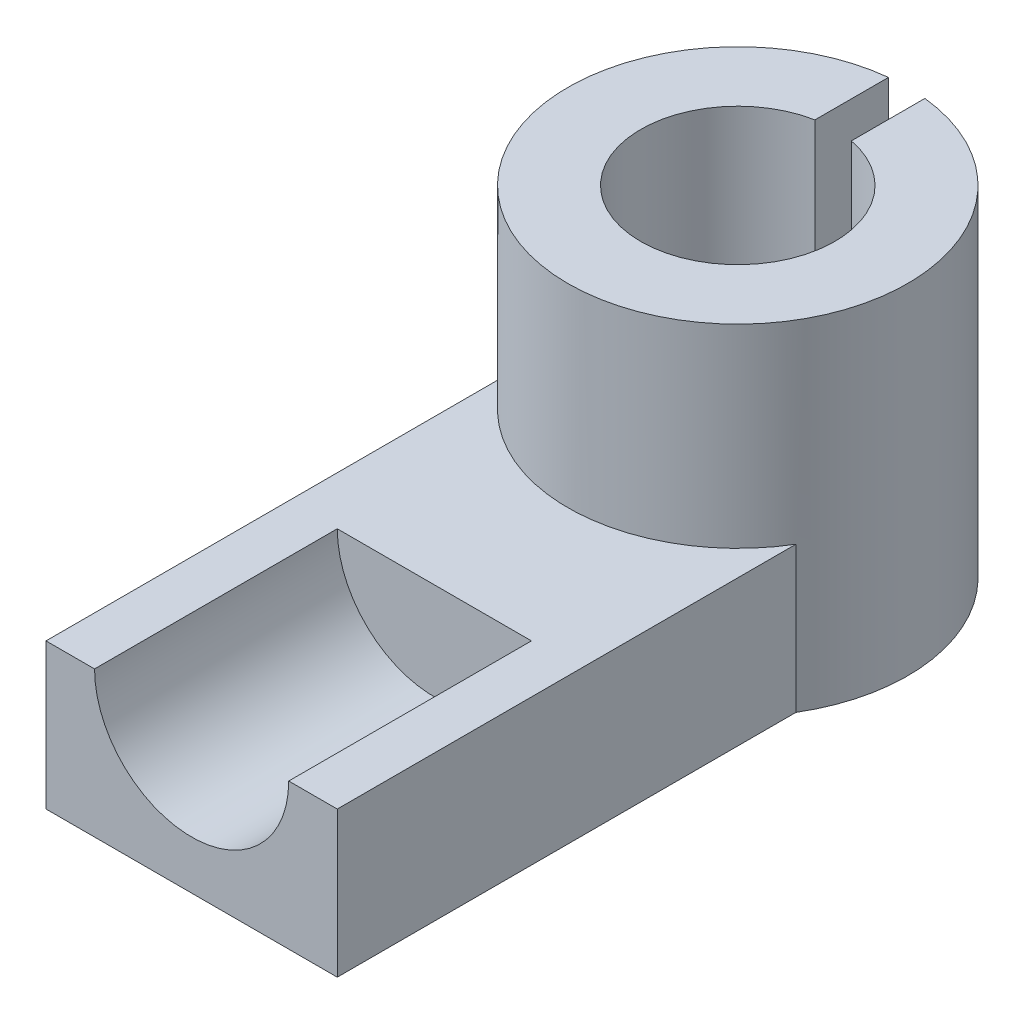
ISO-10303-21;
HEADER;
FILE_DESCRIPTION(('STEP AP214'),'2;1');
FILE_NAME('part.step','',(''),(''),'','','');
FILE_SCHEMA(('AUTOMOTIVE_DESIGN { 1 0 10303 214 1 1 1 1 }'));
ENDSEC;
DATA;
#1=APPLICATION_CONTEXT('core data for automotive mechanical design processes');
#2=APPLICATION_PROTOCOL_DEFINITION('international standard','automotive_design',2000,#1);
#3=PRODUCT_CONTEXT('',#1,'mechanical');
#4=PRODUCT('Part','Part','',(#3));
#5=PRODUCT_RELATED_PRODUCT_CATEGORY('part','',(#4));
#6=PRODUCT_DEFINITION_FORMATION('','',#4);
#7=PRODUCT_DEFINITION_CONTEXT('part definition',#1,'design');
#8=PRODUCT_DEFINITION('design','',#6,#7);
#9=PRODUCT_DEFINITION_SHAPE('','',#8);
#10=(LENGTH_UNIT() NAMED_UNIT(*) SI_UNIT(.MILLI.,.METRE.));
#11=(NAMED_UNIT(*) PLANE_ANGLE_UNIT() SI_UNIT($,.RADIAN.));
#12=(NAMED_UNIT(*) SI_UNIT($,.STERADIAN.) SOLID_ANGLE_UNIT());
#13=UNCERTAINTY_MEASURE_WITH_UNIT(LENGTH_MEASURE(1.E-05),#10,'distance_accuracy_value','');
#14=(GEOMETRIC_REPRESENTATION_CONTEXT(3) GLOBAL_UNCERTAINTY_ASSIGNED_CONTEXT((#13)) GLOBAL_UNIT_ASSIGNED_CONTEXT((#10,
#11,#12)) REPRESENTATION_CONTEXT('',''));
#15=CARTESIAN_POINT('',(0.,0.,0.));
#16=DIRECTION('',(0.,0.,1.));
#17=DIRECTION('',(1.,0.,0.));
#18=AXIS2_PLACEMENT_3D('',#15,#16,#17);
#19=CARTESIAN_POINT('',(0.,56.,0.));
#20=DIRECTION('',(0.,-1.,0.));
#21=DIRECTION('',(0.,0.,-1.));
#22=AXIS2_PLACEMENT_3D('',#19,#20,#21);
#23=CYLINDRICAL_SURFACE('',#22,28.);
#24=DIRECTION('',(0.,-1.,0.));
#25=VECTOR('',#24,1.);
#26=CARTESIAN_POINT('',(24.,24.,14.422205101856));
#27=LINE('',#26,#25);
#28=CARTESIAN_POINT('',(24.,24.,14.422205101856));
#29=VERTEX_POINT('',#28);
#30=CARTESIAN_POINT('',(24.,0.,14.422205101856));
#31=VERTEX_POINT('',#30);
#32=EDGE_CURVE('E174',#29,#31,#27,.T.);
#33=ORIENTED_EDGE('',*,*,#32,.T.);
#34=CARTESIAN_POINT('',(0.,0.,0.));
#35=DIRECTION('',(0.,1.,0.));
#36=DIRECTION('',(0.,0.,1.));
#37=AXIS2_PLACEMENT_3D('',#34,#35,#36);
#38=CIRCLE('',#37,28.);
#39=CARTESIAN_POINT('',(3.,0.,-27.8388218141501));
#40=VERTEX_POINT('',#39);
#41=EDGE_CURVE('E212',#31,#40,#38,.T.);
#42=ORIENTED_EDGE('',*,*,#41,.T.);
#43=DIRECTION('',(0.,-1.,0.));
#44=VECTOR('',#43,1.);
#45=CARTESIAN_POINT('',(3.,56.,-27.8388218141501));
#46=LINE('',#45,#44);
#47=CARTESIAN_POINT('',(3.,56.,-27.8388218141501));
#48=VERTEX_POINT('',#47);
#49=EDGE_CURVE('E191',#48,#40,#46,.T.);
#50=ORIENTED_EDGE('',*,*,#49,.F.);
#51=CARTESIAN_POINT('',(0.,56.,0.));
#52=DIRECTION('',(0.,1.,0.));
#53=DIRECTION('',(0.,0.,1.));
#54=AXIS2_PLACEMENT_3D('',#51,#52,#53);
#55=CIRCLE('',#54,28.);
#56=CARTESIAN_POINT('',(-3.,56.,-27.8388218141501));
#57=VERTEX_POINT('',#56);
#58=EDGE_CURVE('E216',#57,#48,#55,.T.);
#59=ORIENTED_EDGE('',*,*,#58,.F.);
#60=DIRECTION('',(0.,-1.,0.));
#61=VECTOR('',#60,1.);
#62=CARTESIAN_POINT('',(-3.,56.,-27.8388218141501));
#63=LINE('',#62,#61);
#64=CARTESIAN_POINT('',(-3.,0.,-27.8388218141501));
#65=VERTEX_POINT('',#64);
#66=EDGE_CURVE('E188',#65,#57,#63,.F.);
#67=ORIENTED_EDGE('',*,*,#66,.F.);
#68=CARTESIAN_POINT('',(-24.,0.,14.422205101856));
#69=VERTEX_POINT('',#68);
#70=EDGE_CURVE('E220',#65,#69,#38,.T.);
#71=ORIENTED_EDGE('',*,*,#70,.T.);
#72=DIRECTION('',(0.,-1.,0.));
#73=VECTOR('',#72,1.);
#74=CARTESIAN_POINT('',(-24.,24.,14.422205101856));
#75=LINE('',#74,#73);
#76=CARTESIAN_POINT('',(-24.,24.,14.422205101856));
#77=VERTEX_POINT('',#76);
#78=EDGE_CURVE('E67',#77,#69,#75,.T.);
#79=ORIENTED_EDGE('',*,*,#78,.F.);
#80=CARTESIAN_POINT('',(0.,24.,0.));
#81=DIRECTION('',(0.,-1.,0.));
#82=DIRECTION('',(0.,0.,-1.));
#83=AXIS2_PLACEMENT_3D('',#80,#81,#82);
#84=CIRCLE('',#83,28.);
#85=EDGE_CURVE('E156',#29,#77,#84,.T.);
#86=ORIENTED_EDGE('',*,*,#85,.F.);
#87=EDGE_LOOP('',(#33,#42,#50,#59,#67,#71,#79,#86));
#88=FACE_BOUND('',#87,.T.);
#89=ADVANCED_FACE('F45',(#88),#23,.T.);
#90=CARTESIAN_POINT('',(0.,56.,0.));
#91=DIRECTION('',(0.,1.,0.));
#92=DIRECTION('',(0.,0.,1.));
#93=AXIS2_PLACEMENT_3D('',#90,#91,#92);
#94=PLANE('',#93);
#95=DIRECTION('',(0.,0.,-1.));
#96=VECTOR('',#95,1.);
#97=CARTESIAN_POINT('',(3.,56.,-34.7133015368307));
#98=LINE('',#97,#96);
#99=CARTESIAN_POINT('',(3.,56.,-15.7162336455017));
#100=VERTEX_POINT('',#99);
#101=EDGE_CURVE('E198',#100,#48,#98,.T.);
#102=ORIENTED_EDGE('',*,*,#101,.F.);
#103=CARTESIAN_POINT('',(0.,56.,0.));
#104=DIRECTION('',(0.,1.,0.));
#105=DIRECTION('',(0.,0.,1.));
#106=AXIS2_PLACEMENT_3D('',#103,#104,#105);
#107=CIRCLE('',#106,16.);
#108=CARTESIAN_POINT('',(-3.,56.,-15.7162336455017));
#109=VERTEX_POINT('',#108);
#110=EDGE_CURVE('E208',#109,#100,#107,.T.);
#111=ORIENTED_EDGE('',*,*,#110,.F.);
#112=DIRECTION('',(0.,0.,1.));
#113=VECTOR('',#112,1.);
#114=CARTESIAN_POINT('',(-3.,56.,-34.7133015368307));
#115=LINE('',#114,#113);
#116=EDGE_CURVE('E201',#57,#109,#115,.T.);
#117=ORIENTED_EDGE('',*,*,#116,.F.);
#118=ORIENTED_EDGE('',*,*,#58,.T.);
#119=EDGE_LOOP('',(#102,#111,#117,#118));
#120=FACE_BOUND('',#119,.T.);
#121=ADVANCED_FACE('F245',(#120),#94,.T.);
#122=CARTESIAN_POINT('',(0.,0.,0.));
#123=DIRECTION('',(0.,1.,0.));
#124=DIRECTION('',(0.,0.,1.));
#125=AXIS2_PLACEMENT_3D('',#122,#123,#124);
#126=PLANE('',#125);
#127=CARTESIAN_POINT('',(0.,0.,0.));
#128=DIRECTION('',(0.,1.,0.));
#129=DIRECTION('',(0.,0.,1.));
#130=AXIS2_PLACEMENT_3D('',#127,#128,#129);
#131=CIRCLE('',#130,16.);
#132=CARTESIAN_POINT('',(-3.,0.,-15.7162336455017));
#133=VERTEX_POINT('',#132);
#134=CARTESIAN_POINT('',(3.,0.,-15.7162336455017));
#135=VERTEX_POINT('',#134);
#136=EDGE_CURVE('E207',#133,#135,#131,.T.);
#137=ORIENTED_EDGE('',*,*,#136,.T.);
#138=DIRECTION('',(0.,0.,1.));
#139=VECTOR('',#138,1.);
#140=CARTESIAN_POINT('',(3.,0.,-34.7133015368307));
#141=LINE('',#140,#139);
#142=EDGE_CURVE('E195',#40,#135,#141,.T.);
#143=ORIENTED_EDGE('',*,*,#142,.F.);
#144=ORIENTED_EDGE('',*,*,#41,.F.);
#145=DIRECTION('',(0.,0.,-1.));
#146=VECTOR('',#145,1.);
#147=CARTESIAN_POINT('',(24.,0.,90.));
#148=LINE('',#147,#146);
#149=CARTESIAN_POINT('',(24.,0.,90.));
#150=VERTEX_POINT('',#149);
#151=EDGE_CURVE('E150',#150,#31,#148,.T.);
#152=ORIENTED_EDGE('',*,*,#151,.F.);
#153=DIRECTION('',(1.,0.,0.));
#154=VECTOR('',#153,1.);
#155=CARTESIAN_POINT('',(-24.,0.,90.));
#156=LINE('',#155,#154);
#157=CARTESIAN_POINT('',(-24.,0.,90.));
#158=VERTEX_POINT('',#157);
#159=EDGE_CURVE('E164',#158,#150,#156,.T.);
#160=ORIENTED_EDGE('',*,*,#159,.F.);
#161=DIRECTION('',(0.,0.,-1.));
#162=VECTOR('',#161,1.);
#163=CARTESIAN_POINT('',(-24.,0.,90.));
#164=LINE('',#163,#162);
#165=EDGE_CURVE('E144',#158,#69,#164,.T.);
#166=ORIENTED_EDGE('',*,*,#165,.T.);
#167=ORIENTED_EDGE('',*,*,#70,.F.);
#168=DIRECTION('',(0.,0.,-1.));
#169=VECTOR('',#168,1.);
#170=CARTESIAN_POINT('',(-3.,0.,-34.7133015368307));
#171=LINE('',#170,#169);
#172=EDGE_CURVE('E204',#133,#65,#171,.T.);
#173=ORIENTED_EDGE('',*,*,#172,.F.);
#174=EDGE_LOOP('',(#137,#143,#144,#152,#160,#166,#167,#173));
#175=FACE_BOUND('',#174,.T.);
#176=ADVANCED_FACE('F230',(#175),#126,.F.);
#177=CARTESIAN_POINT('',(0.,56.,0.));
#178=DIRECTION('',(0.,-1.,0.));
#179=DIRECTION('',(0.,0.,-1.));
#180=AXIS2_PLACEMENT_3D('',#177,#178,#179);
#181=CYLINDRICAL_SURFACE('',#180,16.);
#182=DIRECTION('',(0.,-1.,0.));
#183=VECTOR('',#182,1.);
#184=CARTESIAN_POINT('',(3.,56.,-15.7162336455017));
#185=LINE('',#184,#183);
#186=EDGE_CURVE('E184',#100,#135,#185,.T.);
#187=ORIENTED_EDGE('',*,*,#186,.T.);
#188=ORIENTED_EDGE('',*,*,#136,.F.);
#189=DIRECTION('',(0.,-1.,0.));
#190=VECTOR('',#189,1.);
#191=CARTESIAN_POINT('',(-3.,56.,-15.7162336455017));
#192=LINE('',#191,#190);
#193=EDGE_CURVE('E180',#133,#109,#192,.F.);
#194=ORIENTED_EDGE('',*,*,#193,.T.);
#195=ORIENTED_EDGE('',*,*,#110,.T.);
#196=EDGE_LOOP('',(#187,#188,#194,#195));
#197=FACE_BOUND('',#196,.T.);
#198=ADVANCED_FACE('F264',(#197),#181,.F.);
#199=CARTESIAN_POINT('',(-3.,-0.001000000000001,-34.7133015368307));
#200=DIRECTION('',(-1.,0.,0.));
#201=DIRECTION('',(0.,0.,1.));
#202=AXIS2_PLACEMENT_3D('',#199,#200,#201);
#203=PLANE('',#202);
#204=ORIENTED_EDGE('',*,*,#66,.T.);
#205=ORIENTED_EDGE('',*,*,#116,.T.);
#206=ORIENTED_EDGE('',*,*,#193,.F.);
#207=ORIENTED_EDGE('',*,*,#172,.T.);
#208=EDGE_LOOP('',(#204,#205,#206,#207));
#209=FACE_BOUND('',#208,.T.);
#210=ADVANCED_FACE('F269',(#209),#203,.F.);
#211=CARTESIAN_POINT('',(3.,-0.001000000000001,-34.7133015368307));
#212=DIRECTION('',(1.,0.,0.));
#213=DIRECTION('',(0.,0.,-1.));
#214=AXIS2_PLACEMENT_3D('',#211,#212,#213);
#215=PLANE('',#214);
#216=ORIENTED_EDGE('',*,*,#49,.T.);
#217=ORIENTED_EDGE('',*,*,#142,.T.);
#218=ORIENTED_EDGE('',*,*,#186,.F.);
#219=ORIENTED_EDGE('',*,*,#101,.T.);
#220=EDGE_LOOP('',(#216,#217,#218,#219));
#221=FACE_BOUND('',#220,.T.);
#222=ADVANCED_FACE('F259',(#221),#215,.F.);
#223=CARTESIAN_POINT('',(-24.,24.,90.));
#224=DIRECTION('',(0.,0.,-1.));
#225=DIRECTION('',(-1.,0.,0.));
#226=AXIS2_PLACEMENT_3D('',#223,#224,#225);
#227=PLANE('',#226);
#228=DIRECTION('',(1.,0.,0.));
#229=VECTOR('',#228,1.);
#230=CARTESIAN_POINT('',(-24.,24.,90.));
#231=LINE('',#230,#229);
#232=CARTESIAN_POINT('',(16.,24.,90.));
#233=VERTEX_POINT('',#232);
#234=CARTESIAN_POINT('',(24.,24.,90.));
#235=VERTEX_POINT('',#234);
#236=EDGE_CURVE('E134',#233,#235,#231,.T.);
#237=ORIENTED_EDGE('',*,*,#236,.F.);
#238=CARTESIAN_POINT('',(0.,24.,90.));
#239=DIRECTION('',(0.,0.,1.));
#240=DIRECTION('',(1.,0.,0.));
#241=AXIS2_PLACEMENT_3D('',#238,#239,#240);
#242=CIRCLE('',#241,16.);
#243=CARTESIAN_POINT('',(-16.,24.,90.));
#244=VERTEX_POINT('',#243);
#245=EDGE_CURVE('E121',#244,#233,#242,.T.);
#246=ORIENTED_EDGE('',*,*,#245,.F.);
#247=CARTESIAN_POINT('',(-24.,24.,90.));
#248=VERTEX_POINT('',#247);
#249=EDGE_CURVE('E143',#248,#244,#231,.T.);
#250=ORIENTED_EDGE('',*,*,#249,.F.);
#251=DIRECTION('',(0.,-1.,0.));
#252=VECTOR('',#251,1.);
#253=CARTESIAN_POINT('',(-24.,24.,90.));
#254=LINE('',#253,#252);
#255=EDGE_CURVE('E163',#248,#158,#254,.T.);
#256=ORIENTED_EDGE('',*,*,#255,.T.);
#257=ORIENTED_EDGE('',*,*,#159,.T.);
#258=DIRECTION('',(0.,-1.,0.));
#259=VECTOR('',#258,1.);
#260=CARTESIAN_POINT('',(24.,24.,90.));
#261=LINE('',#260,#259);
#262=EDGE_CURVE('E141',#235,#150,#261,.T.);
#263=ORIENTED_EDGE('',*,*,#262,.F.);
#264=EDGE_LOOP('',(#237,#246,#250,#256,#257,#263));
#265=FACE_BOUND('',#264,.T.);
#266=ADVANCED_FACE('F138',(#265),#227,.F.);
#267=CARTESIAN_POINT('',(24.,24.,90.));
#268=DIRECTION('',(-1.,0.,0.));
#269=DIRECTION('',(0.,0.,1.));
#270=AXIS2_PLACEMENT_3D('',#267,#268,#269);
#271=PLANE('',#270);
#272=ORIENTED_EDGE('',*,*,#151,.T.);
#273=ORIENTED_EDGE('',*,*,#32,.F.);
#274=DIRECTION('',(0.,0.,-1.));
#275=VECTOR('',#274,1.);
#276=CARTESIAN_POINT('',(24.,24.,90.));
#277=LINE('',#276,#275);
#278=EDGE_CURVE('E148',#235,#29,#277,.T.);
#279=ORIENTED_EDGE('',*,*,#278,.F.);
#280=ORIENTED_EDGE('',*,*,#262,.T.);
#281=EDGE_LOOP('',(#272,#273,#279,#280));
#282=FACE_BOUND('',#281,.T.);
#283=ADVANCED_FACE('F234',(#282),#271,.F.);
#284=CARTESIAN_POINT('',(-24.,24.,90.));
#285=DIRECTION('',(-1.,0.,0.));
#286=DIRECTION('',(0.,0.,1.));
#287=AXIS2_PLACEMENT_3D('',#284,#285,#286);
#288=PLANE('',#287);
#289=ORIENTED_EDGE('',*,*,#165,.F.);
#290=ORIENTED_EDGE('',*,*,#255,.F.);
#291=DIRECTION('',(0.,0.,-1.));
#292=VECTOR('',#291,1.);
#293=CARTESIAN_POINT('',(-24.,24.,90.));
#294=LINE('',#293,#292);
#295=EDGE_CURVE('E159',#248,#77,#294,.T.);
#296=ORIENTED_EDGE('',*,*,#295,.T.);
#297=ORIENTED_EDGE('',*,*,#78,.T.);
#298=EDGE_LOOP('',(#289,#290,#296,#297));
#299=FACE_BOUND('',#298,.T.);
#300=ADVANCED_FACE('F232',(#299),#288,.T.);
#301=CARTESIAN_POINT('',(0.,24.,0.));
#302=DIRECTION('',(0.,-1.,0.));
#303=DIRECTION('',(0.,0.,-1.));
#304=AXIS2_PLACEMENT_3D('',#301,#302,#303);
#305=PLANE('',#304);
#306=DIRECTION('',(-1.,0.,0.));
#307=VECTOR('',#306,1.);
#308=CARTESIAN_POINT('',(0.,24.,50.));
#309=LINE('',#308,#307);
#310=CARTESIAN_POINT('',(16.,24.,50.));
#311=VERTEX_POINT('',#310);
#312=CARTESIAN_POINT('',(-16.,24.,50.));
#313=VERTEX_POINT('',#312);
#314=EDGE_CURVE('E136',#311,#313,#309,.T.);
#315=ORIENTED_EDGE('',*,*,#314,.F.);
#316=DIRECTION('',(0.,0.,1.));
#317=VECTOR('',#316,1.);
#318=CARTESIAN_POINT('',(16.,24.,50.));
#319=LINE('',#318,#317);
#320=EDGE_CURVE('E11',#311,#233,#319,.T.);
#321=ORIENTED_EDGE('',*,*,#320,.T.);
#322=ORIENTED_EDGE('',*,*,#236,.T.);
#323=ORIENTED_EDGE('',*,*,#278,.T.);
#324=ORIENTED_EDGE('',*,*,#85,.T.);
#325=ORIENTED_EDGE('',*,*,#295,.F.);
#326=ORIENTED_EDGE('',*,*,#249,.T.);
#327=DIRECTION('',(0.,0.,1.));
#328=VECTOR('',#327,1.);
#329=CARTESIAN_POINT('',(-16.,24.,50.));
#330=LINE('',#329,#328);
#331=EDGE_CURVE('E53',#244,#313,#330,.F.);
#332=ORIENTED_EDGE('',*,*,#331,.T.);
#333=EDGE_LOOP('',(#315,#321,#322,#323,#324,#325,#326,#332));
#334=FACE_BOUND('',#333,.T.);
#335=ADVANCED_FACE('F132',(#334),#305,.F.);
#336=CARTESIAN_POINT('',(0.,24.,50.));
#337=DIRECTION('',(0.,0.,1.));
#338=DIRECTION('',(1.,0.,0.));
#339=AXIS2_PLACEMENT_3D('',#336,#337,#338);
#340=CYLINDRICAL_SURFACE('',#339,16.);
#341=CARTESIAN_POINT('',(0.,24.,50.));
#342=DIRECTION('',(0.,0.,1.));
#343=DIRECTION('',(1.,0.,0.));
#344=AXIS2_PLACEMENT_3D('',#341,#342,#343);
#345=CIRCLE('',#344,16.);
#346=EDGE_CURVE('E59',#313,#311,#345,.T.);
#347=ORIENTED_EDGE('',*,*,#346,.F.);
#348=ORIENTED_EDGE('',*,*,#331,.F.);
#349=ORIENTED_EDGE('',*,*,#245,.T.);
#350=ORIENTED_EDGE('',*,*,#320,.F.);
#351=EDGE_LOOP('',(#347,#348,#349,#350));
#352=FACE_BOUND('',#351,.T.);
#353=ADVANCED_FACE('F122',(#352),#340,.F.);
#354=CARTESIAN_POINT('',(0.,24.,50.));
#355=DIRECTION('',(0.,0.,1.));
#356=DIRECTION('',(1.,0.,0.));
#357=AXIS2_PLACEMENT_3D('',#354,#355,#356);
#358=PLANE('',#357);
#359=ORIENTED_EDGE('',*,*,#314,.T.);
#360=ORIENTED_EDGE('',*,*,#346,.T.);
#361=EDGE_LOOP('',(#359,#360));
#362=FACE_BOUND('',#361,.T.);
#363=ADVANCED_FACE('F310',(#362),#358,.T.);
#364=CLOSED_SHELL('',(#89,#121,#176,#198,#210,#222,#266,#283,#300,#335,#353,#363));
#365=MANIFOLD_SOLID_BREP('B2',#364);
#366=ADVANCED_BREP_SHAPE_REPRESENTATION('',(#18,#365),#14);
#367=SHAPE_DEFINITION_REPRESENTATION(#9,#366);
ENDSEC;
END-ISO-10303-21;
